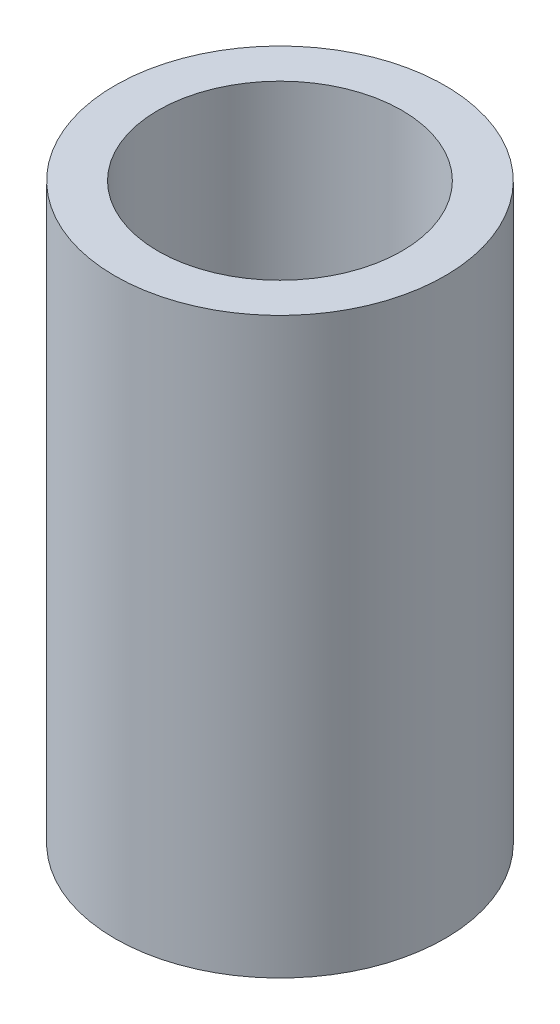
ISO-10303-21;
HEADER;
FILE_DESCRIPTION(('STEP AP214'),'2;1');
FILE_NAME('part.step','',(''),(''),'','','');
FILE_SCHEMA(('AUTOMOTIVE_DESIGN { 1 0 10303 214 1 1 1 1 }'));
ENDSEC;
DATA;
#1=APPLICATION_CONTEXT('core data for automotive mechanical design processes');
#2=APPLICATION_PROTOCOL_DEFINITION('international standard','automotive_design',2000,#1);
#3=PRODUCT_CONTEXT('',#1,'mechanical');
#4=PRODUCT('Part','Part','',(#3));
#5=PRODUCT_RELATED_PRODUCT_CATEGORY('part','',(#4));
#6=PRODUCT_DEFINITION_FORMATION('','',#4);
#7=PRODUCT_DEFINITION_CONTEXT('part definition',#1,'design');
#8=PRODUCT_DEFINITION('design','',#6,#7);
#9=PRODUCT_DEFINITION_SHAPE('','',#8);
#10=(LENGTH_UNIT() NAMED_UNIT(*) SI_UNIT(.MILLI.,.METRE.));
#11=(NAMED_UNIT(*) PLANE_ANGLE_UNIT() SI_UNIT($,.RADIAN.));
#12=(NAMED_UNIT(*) SI_UNIT($,.STERADIAN.) SOLID_ANGLE_UNIT());
#13=UNCERTAINTY_MEASURE_WITH_UNIT(LENGTH_MEASURE(1.E-05),#10,'distance_accuracy_value','');
#14=(GEOMETRIC_REPRESENTATION_CONTEXT(3) GLOBAL_UNCERTAINTY_ASSIGNED_CONTEXT((#13)) GLOBAL_UNIT_ASSIGNED_CONTEXT((#10,
#11,#12)) REPRESENTATION_CONTEXT('',''));
#15=CARTESIAN_POINT('',(0.,0.,0.));
#16=DIRECTION('',(0.,0.,1.));
#17=DIRECTION('',(1.,0.,0.));
#18=AXIS2_PLACEMENT_3D('',#15,#16,#17);
#19=CARTESIAN_POINT('',(0.,20.,0.));
#20=DIRECTION('',(0.,1.,0.));
#21=DIRECTION('',(0.,0.,1.));
#22=AXIS2_PLACEMENT_3D('',#19,#20,#21);
#23=PLANE('',#22);
#24=CARTESIAN_POINT('',(0.,20.,0.));
#25=DIRECTION('',(0.,1.,0.));
#26=DIRECTION('',(0.,0.,1.));
#27=AXIS2_PLACEMENT_3D('',#24,#25,#26);
#28=CIRCLE('',#27,5.75);
#29=CARTESIAN_POINT('',(0.,20.,5.75));
#30=VERTEX_POINT('',#29);
#31=EDGE_CURVE('E10',#30,#30,#28,.T.);
#32=ORIENTED_EDGE('',*,*,#31,.T.);
#33=EDGE_LOOP('',(#32));
#34=FACE_BOUND('',#33,.T.);
#35=CARTESIAN_POINT('',(0.,20.,0.));
#36=DIRECTION('',(0.,1.,0.));
#37=DIRECTION('',(0.,0.,1.));
#38=AXIS2_PLACEMENT_3D('',#35,#36,#37);
#39=CIRCLE('',#38,4.25);
#40=CARTESIAN_POINT('',(0.,20.,4.25));
#41=VERTEX_POINT('',#40);
#42=EDGE_CURVE('E50',#41,#41,#39,.T.);
#43=ORIENTED_EDGE('',*,*,#42,.F.);
#44=EDGE_LOOP('',(#43));
#45=FACE_BOUND('',#44,.T.);
#46=ADVANCED_FACE('F39',(#34,#45),#23,.T.);
#47=CARTESIAN_POINT('',(0.,0.,0.));
#48=DIRECTION('',(0.,1.,0.));
#49=DIRECTION('',(0.,0.,1.));
#50=AXIS2_PLACEMENT_3D('',#47,#48,#49);
#51=PLANE('',#50);
#52=CARTESIAN_POINT('',(0.,0.,0.));
#53=DIRECTION('',(0.,1.,0.));
#54=DIRECTION('',(0.,0.,1.));
#55=AXIS2_PLACEMENT_3D('',#52,#53,#54);
#56=CIRCLE('',#55,5.75);
#57=CARTESIAN_POINT('',(0.,0.,5.75));
#58=VERTEX_POINT('',#57);
#59=EDGE_CURVE('E43',#58,#58,#56,.T.);
#60=ORIENTED_EDGE('',*,*,#59,.F.);
#61=EDGE_LOOP('',(#60));
#62=FACE_BOUND('',#61,.T.);
#63=CARTESIAN_POINT('',(0.,0.,0.));
#64=DIRECTION('',(0.,1.,0.));
#65=DIRECTION('',(0.,0.,1.));
#66=AXIS2_PLACEMENT_3D('',#63,#64,#65);
#67=CIRCLE('',#66,4.25);
#68=CARTESIAN_POINT('',(0.,0.,4.25));
#69=VERTEX_POINT('',#68);
#70=EDGE_CURVE('E52',#69,#69,#67,.T.);
#71=ORIENTED_EDGE('',*,*,#70,.T.);
#72=EDGE_LOOP('',(#71));
#73=FACE_BOUND('',#72,.T.);
#74=ADVANCED_FACE('F62',(#62,#73),#51,.F.);
#75=CARTESIAN_POINT('',(0.,20.,0.));
#76=DIRECTION('',(0.,-1.,0.));
#77=DIRECTION('',(0.,0.,-1.));
#78=AXIS2_PLACEMENT_3D('',#75,#76,#77);
#79=CYLINDRICAL_SURFACE('',#78,5.75);
#80=ORIENTED_EDGE('',*,*,#31,.F.);
#81=EDGE_LOOP('',(#80));
#82=FACE_BOUND('',#81,.T.);
#83=ORIENTED_EDGE('',*,*,#59,.T.);
#84=EDGE_LOOP('',(#83));
#85=FACE_BOUND('',#84,.T.);
#86=ADVANCED_FACE('F41',(#82,#85),#79,.T.);
#87=CARTESIAN_POINT('',(0.,20.,0.));
#88=DIRECTION('',(0.,-1.,0.));
#89=DIRECTION('',(0.,0.,-1.));
#90=AXIS2_PLACEMENT_3D('',#87,#88,#89);
#91=CYLINDRICAL_SURFACE('',#90,4.25);
#92=ORIENTED_EDGE('',*,*,#42,.T.);
#93=EDGE_LOOP('',(#92));
#94=FACE_BOUND('',#93,.T.);
#95=ORIENTED_EDGE('',*,*,#70,.F.);
#96=EDGE_LOOP('',(#95));
#97=FACE_BOUND('',#96,.T.);
#98=ADVANCED_FACE('F58',(#94,#97),#91,.F.);
#99=CLOSED_SHELL('',(#46,#74,#86,#98));
#100=MANIFOLD_SOLID_BREP('B2',#99);
#101=ADVANCED_BREP_SHAPE_REPRESENTATION('',(#18,#100),#14);
#102=SHAPE_DEFINITION_REPRESENTATION(#9,#101);
ENDSEC;
END-ISO-10303-21;
